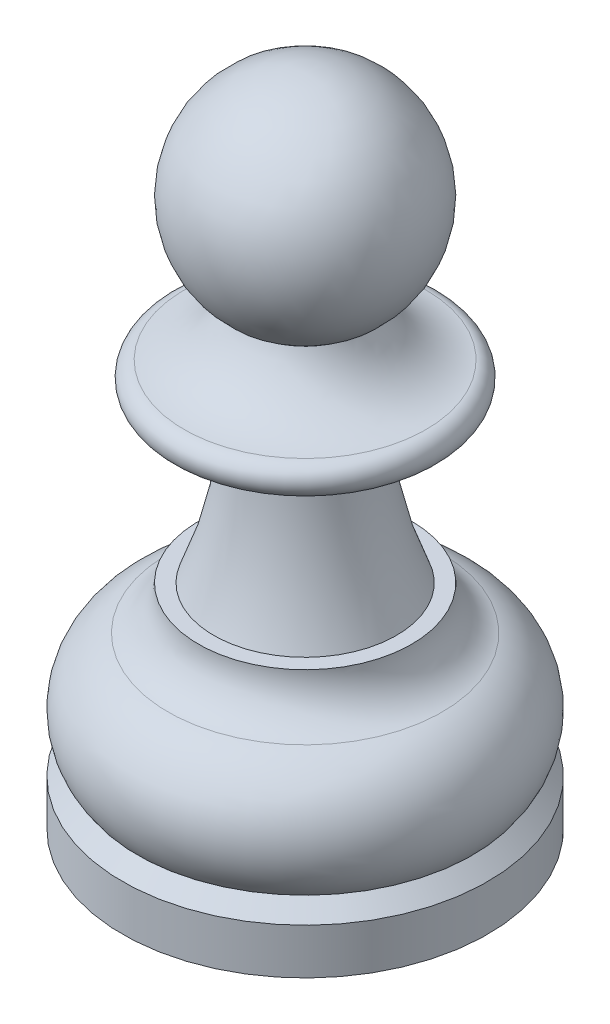
ISO-10303-21;
HEADER;
FILE_DESCRIPTION(('STEP AP214'),'2;1');
FILE_NAME('part.step','',(''),(''),'','','');
FILE_SCHEMA(('AUTOMOTIVE_DESIGN { 1 0 10303 214 1 1 1 1 }'));
ENDSEC;
DATA;
#1=APPLICATION_CONTEXT('core data for automotive mechanical design processes');
#2=APPLICATION_PROTOCOL_DEFINITION('international standard','automotive_design',2000,#1);
#3=PRODUCT_CONTEXT('',#1,'mechanical');
#4=PRODUCT('Part','Part','',(#3));
#5=PRODUCT_RELATED_PRODUCT_CATEGORY('part','',(#4));
#6=PRODUCT_DEFINITION_FORMATION('','',#4);
#7=PRODUCT_DEFINITION_CONTEXT('part definition',#1,'design');
#8=PRODUCT_DEFINITION('design','',#6,#7);
#9=PRODUCT_DEFINITION_SHAPE('','',#8);
#10=(LENGTH_UNIT() NAMED_UNIT(*) SI_UNIT(.MILLI.,.METRE.));
#11=(NAMED_UNIT(*) PLANE_ANGLE_UNIT() SI_UNIT($,.RADIAN.));
#12=(NAMED_UNIT(*) SI_UNIT($,.STERADIAN.) SOLID_ANGLE_UNIT());
#13=UNCERTAINTY_MEASURE_WITH_UNIT(LENGTH_MEASURE(1.E-05),#10,'distance_accuracy_value','');
#14=(GEOMETRIC_REPRESENTATION_CONTEXT(3) GLOBAL_UNCERTAINTY_ASSIGNED_CONTEXT((#13)) GLOBAL_UNIT_ASSIGNED_CONTEXT((#10,
#11,#12)) REPRESENTATION_CONTEXT('',''));
#15=CARTESIAN_POINT('',(0.,0.,0.));
#16=DIRECTION('',(0.,0.,1.));
#17=DIRECTION('',(1.,0.,0.));
#18=AXIS2_PLACEMENT_3D('',#15,#16,#17);
#19=CARTESIAN_POINT('',(0.,0.,0.));
#20=DIRECTION('',(0.,-1.,0.));
#21=DIRECTION('',(0.,0.,-1.));
#22=AXIS2_PLACEMENT_3D('',#19,#20,#21);
#23=PLANE('',#22);
#24=CARTESIAN_POINT('',(0.,0.,0.));
#25=DIRECTION('',(0.,-1.,0.));
#26=DIRECTION('',(0.,0.,-1.));
#27=AXIS2_PLACEMENT_3D('',#24,#25,#26);
#28=CIRCLE('',#27,12.);
#29=CARTESIAN_POINT('',(0.,0.,-12.));
#30=VERTEX_POINT('',#29);
#31=EDGE_CURVE('E10',#30,#30,#28,.T.);
#32=ORIENTED_EDGE('',*,*,#31,.T.);
#33=EDGE_LOOP('',(#32));
#34=FACE_BOUND('',#33,.T.);
#35=ADVANCED_FACE('F30',(#34),#23,.T.);
#36=CARTESIAN_POINT('',(0.,0.,0.));
#37=DIRECTION('',(0.,-1.,0.));
#38=DIRECTION('',(0.,0.,-1.));
#39=AXIS2_PLACEMENT_3D('',#36,#37,#38);
#40=CYLINDRICAL_SURFACE('',#39,12.);
#41=CARTESIAN_POINT('',(0.,3.,0.));
#42=DIRECTION('',(0.,-1.,0.));
#43=DIRECTION('',(0.,0.,-1.));
#44=AXIS2_PLACEMENT_3D('',#41,#42,#43);
#45=CIRCLE('',#44,12.);
#46=CARTESIAN_POINT('',(0.,3.,-12.));
#47=VERTEX_POINT('',#46);
#48=EDGE_CURVE('E36',#47,#47,#45,.T.);
#49=ORIENTED_EDGE('',*,*,#48,.T.);
#50=EDGE_LOOP('',(#49));
#51=FACE_BOUND('',#50,.T.);
#52=ORIENTED_EDGE('',*,*,#31,.F.);
#53=EDGE_LOOP('',(#52));
#54=FACE_BOUND('',#53,.T.);
#55=ADVANCED_FACE('F80',(#51,#54),#40,.T.);
#56=CARTESIAN_POINT('',(0.,3.,0.));
#57=DIRECTION('',(0.,-1.,0.));
#58=DIRECTION('',(0.,0.,-1.));
#59=AXIS2_PLACEMENT_3D('',#56,#57,#58);
#60=CONICAL_SURFACE('',#59,12.,0.785398163397456);
#61=CARTESIAN_POINT('',(0.,3.99999999999999,0.));
#62=DIRECTION('',(0.,-1.,0.));
#63=DIRECTION('',(0.,0.,-1.));
#64=AXIS2_PLACEMENT_3D('',#61,#62,#63);
#65=CIRCLE('',#64,11.);
#66=CARTESIAN_POINT('',(0.,3.99999999999999,-11.));
#67=VERTEX_POINT('',#66);
#68=EDGE_CURVE('E40',#67,#67,#65,.T.);
#69=ORIENTED_EDGE('',*,*,#68,.T.);
#70=EDGE_LOOP('',(#69));
#71=FACE_BOUND('',#70,.T.);
#72=ORIENTED_EDGE('',*,*,#48,.F.);
#73=EDGE_LOOP('',(#72));
#74=FACE_BOUND('',#73,.T.);
#75=ADVANCED_FACE('F84',(#71,#74),#60,.T.);
#76=CARTESIAN_POINT('',(0.,6.85164477067986,0.));
#77=DIRECTION('',(0.,-1.,0.));
#78=DIRECTION('',(0.,0.,-1.));
#79=AXIS2_PLACEMENT_3D('',#76,#77,#78);
#80=TOROIDAL_SURFACE('',#79,7.43406105092708,4.56593894907292);
#81=CARTESIAN_POINT('',(0.,11.1406579082719,0.));
#82=DIRECTION('',(0.,-1.,0.));
#83=DIRECTION('',(0.,0.,-1.));
#84=AXIS2_PLACEMENT_3D('',#81,#82,#83);
#85=CIRCLE('',#84,9.);
#86=CARTESIAN_POINT('',(0.,11.1406579082719,-9.));
#87=VERTEX_POINT('',#86);
#88=EDGE_CURVE('E44',#87,#87,#85,.T.);
#89=ORIENTED_EDGE('',*,*,#88,.T.);
#90=EDGE_LOOP('',(#89));
#91=FACE_BOUND('',#90,.T.);
#92=ORIENTED_EDGE('',*,*,#68,.F.);
#93=EDGE_LOOP('',(#92));
#94=FACE_BOUND('',#93,.T.);
#95=ADVANCED_FACE('F88',(#91,#94),#80,.T.);
#96=CARTESIAN_POINT('',(0.,14.,0.));
#97=DIRECTION('',(0.,-1.,0.));
#98=DIRECTION('',(0.,0.,-1.));
#99=AXIS2_PLACEMENT_3D('',#96,#97,#98);
#100=TOROIDAL_SURFACE('',#99,10.0439592993819,3.04395929938194);
#101=CARTESIAN_POINT('',(0.,14.,0.));
#102=DIRECTION('',(0.,-1.,0.));
#103=DIRECTION('',(0.,0.,-1.));
#104=AXIS2_PLACEMENT_3D('',#101,#102,#103);
#105=CIRCLE('',#104,7.);
#106=CARTESIAN_POINT('',(0.,14.,-7.));
#107=VERTEX_POINT('',#106);
#108=EDGE_CURVE('E49',#107,#107,#105,.T.);
#109=ORIENTED_EDGE('',*,*,#108,.T.);
#110=EDGE_LOOP('',(#109));
#111=FACE_BOUND('',#110,.T.);
#112=ORIENTED_EDGE('',*,*,#88,.F.);
#113=EDGE_LOOP('',(#112));
#114=FACE_BOUND('',#113,.T.);
#115=ADVANCED_FACE('F95',(#111,#114),#100,.F.);
#116=CARTESIAN_POINT('',(0.,14.,-6.));
#117=DIRECTION('',(0.,1.,0.));
#118=DIRECTION('',(0.,0.,1.));
#119=AXIS2_PLACEMENT_3D('',#116,#117,#118);
#120=PLANE('',#119);
#121=CARTESIAN_POINT('',(0.,14.,0.));
#122=DIRECTION('',(0.,-1.,0.));
#123=DIRECTION('',(0.,0.,-1.));
#124=AXIS2_PLACEMENT_3D('',#121,#122,#123);
#125=CIRCLE('',#124,5.99999999999999);
#126=CARTESIAN_POINT('',(0.,14.,-5.99999999999999));
#127=VERTEX_POINT('',#126);
#128=EDGE_CURVE('E52',#127,#127,#125,.T.);
#129=ORIENTED_EDGE('',*,*,#128,.T.);
#130=EDGE_LOOP('',(#129));
#131=FACE_BOUND('',#130,.T.);
#132=ORIENTED_EDGE('',*,*,#108,.F.);
#133=EDGE_LOOP('',(#132));
#134=FACE_BOUND('',#133,.T.);
#135=ADVANCED_FACE('F99',(#131,#134),#120,.T.);
#136=CARTESIAN_POINT('',(0.,24.,0.));
#137=DIRECTION('',(0.,-1.,0.));
#138=DIRECTION('',(0.,0.,-1.));
#139=AXIS2_PLACEMENT_3D('',#136,#137,#138);
#140=TOROIDAL_SURFACE('',#139,30.,26.);
#141=CARTESIAN_POINT('',(0.,24.,0.));
#142=DIRECTION('',(0.,-1.,0.));
#143=DIRECTION('',(0.,0.,-1.));
#144=AXIS2_PLACEMENT_3D('',#141,#142,#143);
#145=CIRCLE('',#144,4.);
#146=CARTESIAN_POINT('',(0.,24.,-4.));
#147=VERTEX_POINT('',#146);
#148=EDGE_CURVE('E55',#147,#147,#145,.T.);
#149=ORIENTED_EDGE('',*,*,#148,.T.);
#150=EDGE_LOOP('',(#149));
#151=FACE_BOUND('',#150,.T.);
#152=ORIENTED_EDGE('',*,*,#128,.F.);
#153=EDGE_LOOP('',(#152));
#154=FACE_BOUND('',#153,.T.);
#155=ADVANCED_FACE('F103',(#151,#154),#140,.F.);
#156=CARTESIAN_POINT('',(0.,24.,0.));
#157=DIRECTION('',(0.,1.,0.));
#158=DIRECTION('',(0.,0.,1.));
#159=AXIS2_PLACEMENT_3D('',#156,#157,#158);
#160=CONICAL_SURFACE('',#159,4.,1.39626340159547);
#161=CARTESIAN_POINT('',(0.,24.7053079228338,0.));
#162=DIRECTION('',(0.,-1.,0.));
#163=DIRECTION('',(0.,0.,-1.));
#164=AXIS2_PLACEMENT_3D('',#161,#162,#163);
#165=CIRCLE('',#164,8.);
#166=CARTESIAN_POINT('',(0.,24.7053079228338,-8.));
#167=VERTEX_POINT('',#166);
#168=EDGE_CURVE('E58',#167,#167,#165,.T.);
#169=ORIENTED_EDGE('',*,*,#168,.T.);
#170=EDGE_LOOP('',(#169));
#171=FACE_BOUND('',#170,.T.);
#172=ORIENTED_EDGE('',*,*,#148,.F.);
#173=EDGE_LOOP('',(#172));
#174=FACE_BOUND('',#173,.T.);
#175=ADVANCED_FACE('F107',(#171,#174),#160,.T.);
#176=CARTESIAN_POINT('',(0.,25.690115675846,0.));
#177=DIRECTION('',(0.,-1.,0.));
#178=DIRECTION('',(0.,0.,-1.));
#179=AXIS2_PLACEMENT_3D('',#176,#177,#178);
#180=TOROIDAL_SURFACE('',#179,7.82635182233308,1.);
#181=CARTESIAN_POINT('',(0.,26.6832031350185,0.));
#182=DIRECTION('',(0.,-1.,0.));
#183=DIRECTION('',(0.,0.,-1.));
#184=AXIS2_PLACEMENT_3D('',#181,#182,#183);
#185=CIRCLE('',#184,7.94372855952706);
#186=CARTESIAN_POINT('',(0.,26.6832031350185,-7.94372855952706));
#187=VERTEX_POINT('',#186);
#188=EDGE_CURVE('E61',#187,#187,#185,.T.);
#189=ORIENTED_EDGE('',*,*,#188,.T.);
#190=EDGE_LOOP('',(#189));
#191=FACE_BOUND('',#190,.T.);
#192=ORIENTED_EDGE('',*,*,#168,.F.);
#193=EDGE_LOOP('',(#192));
#194=FACE_BOUND('',#193,.T.);
#195=ADVANCED_FACE('F77',(#191,#194),#180,.T.);
#196=CARTESIAN_POINT('',(0.,32.000674069009,0.));
#197=DIRECTION('',(0.,-1.,0.));
#198=DIRECTION('',(0.,0.,-1.));
#199=AXIS2_PLACEMENT_3D('',#196,#197,#198);
#200=TOROIDAL_SURFACE('',#199,8.57222042355254,5.3544840234125);
#201=CARTESIAN_POINT('',(0.,30.,0.));
#202=DIRECTION('',(0.,-1.,0.));
#203=DIRECTION('',(0.,0.,-1.));
#204=AXIS2_PLACEMENT_3D('',#201,#202,#203);
#205=CIRCLE('',#204,3.60555127546399);
#206=CARTESIAN_POINT('',(0.,30.,-3.60555127546399));
#207=VERTEX_POINT('',#206);
#208=EDGE_CURVE('E64',#207,#207,#205,.T.);
#209=ORIENTED_EDGE('',*,*,#208,.T.);
#210=EDGE_LOOP('',(#209));
#211=FACE_BOUND('',#210,.T.);
#212=ORIENTED_EDGE('',*,*,#188,.F.);
#213=EDGE_LOOP('',(#212));
#214=FACE_BOUND('',#213,.T.);
#215=ADVANCED_FACE('F68',(#211,#214),#200,.F.);
#216=CARTESIAN_POINT('',(0.,36.,0.));
#217=DIRECTION('',(0.,-1.,0.));
#218=DIRECTION('',(0.,0.,-1.));
#219=AXIS2_PLACEMENT_3D('',#216,#217,#218);
#220=SPHERICAL_SURFACE('',#219,7.);
#221=ORIENTED_EDGE('',*,*,#208,.F.);
#222=EDGE_LOOP('',(#221));
#223=FACE_BOUND('',#222,.T.);
#224=ADVANCED_FACE('F71',(#223),#220,.T.);
#225=CLOSED_SHELL('',(#35,#55,#75,#95,#115,#135,#155,#175,#195,#215,#224));
#226=MANIFOLD_SOLID_BREP('B2',#225);
#227=ADVANCED_BREP_SHAPE_REPRESENTATION('',(#18,#226),#14);
#228=SHAPE_DEFINITION_REPRESENTATION(#9,#227);
ENDSEC;
END-ISO-10303-21;
